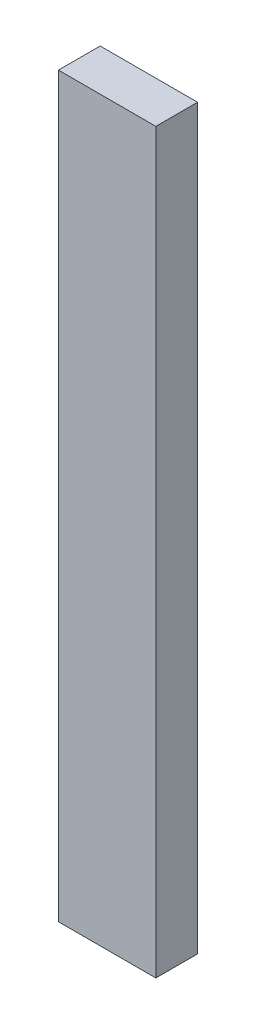
ISO-10303-21;
HEADER;
FILE_DESCRIPTION(('STEP AP214'),'2;1');
FILE_NAME('part.step','',(''),(''),'','','');
FILE_SCHEMA(('AUTOMOTIVE_DESIGN { 1 0 10303 214 1 1 1 1 }'));
ENDSEC;
DATA;
#1=APPLICATION_CONTEXT('core data for automotive mechanical design processes');
#2=APPLICATION_PROTOCOL_DEFINITION('international standard','automotive_design',2000,#1);
#3=PRODUCT_CONTEXT('',#1,'mechanical');
#4=PRODUCT('Part','Part','',(#3));
#5=PRODUCT_RELATED_PRODUCT_CATEGORY('part','',(#4));
#6=PRODUCT_DEFINITION_FORMATION('','',#4);
#7=PRODUCT_DEFINITION_CONTEXT('part definition',#1,'design');
#8=PRODUCT_DEFINITION('design','',#6,#7);
#9=PRODUCT_DEFINITION_SHAPE('','',#8);
#10=(LENGTH_UNIT() NAMED_UNIT(*) SI_UNIT(.MILLI.,.METRE.));
#11=(NAMED_UNIT(*) PLANE_ANGLE_UNIT() SI_UNIT($,.RADIAN.));
#12=(NAMED_UNIT(*) SI_UNIT($,.STERADIAN.) SOLID_ANGLE_UNIT());
#13=UNCERTAINTY_MEASURE_WITH_UNIT(LENGTH_MEASURE(1.E-05),#10,'distance_accuracy_value','');
#14=(GEOMETRIC_REPRESENTATION_CONTEXT(3) GLOBAL_UNCERTAINTY_ASSIGNED_CONTEXT((#13)) GLOBAL_UNIT_ASSIGNED_CONTEXT((#10,
#11,#12)) REPRESENTATION_CONTEXT('',''));
#15=CARTESIAN_POINT('',(0.,0.,0.));
#16=DIRECTION('',(0.,0.,1.));
#17=DIRECTION('',(1.,0.,0.));
#18=AXIS2_PLACEMENT_3D('',#15,#16,#17);
#19=CARTESIAN_POINT('',(-292.1,1149.34999999999,38.1));
#20=DIRECTION('',(1.,0.,0.));
#21=DIRECTION('',(0.,0.,-1.));
#22=AXIS2_PLACEMENT_3D('',#19,#20,#21);
#23=PLANE('',#22);
#24=DIRECTION('',(0.,-1.,0.));
#25=VECTOR('',#24,1.);
#26=CARTESIAN_POINT('',(-292.1,1149.34999999999,0.));
#27=LINE('',#26,#25);
#28=CARTESIAN_POINT('',(-292.1,1149.34999999999,0.));
#29=VERTEX_POINT('',#28);
#30=CARTESIAN_POINT('',(-292.1,476.250000000002,0.));
#31=VERTEX_POINT('',#30);
#32=EDGE_CURVE('E96',#29,#31,#27,.T.);
#33=ORIENTED_EDGE('',*,*,#32,.T.);
#34=DIRECTION('',(0.,0.,-1.));
#35=VECTOR('',#34,1.);
#36=CARTESIAN_POINT('',(-292.1,476.250000000002,38.1));
#37=LINE('',#36,#35);
#38=CARTESIAN_POINT('',(-292.1,476.250000000002,38.1));
#39=VERTEX_POINT('',#38);
#40=EDGE_CURVE('E11',#39,#31,#37,.T.);
#41=ORIENTED_EDGE('',*,*,#40,.F.);
#42=DIRECTION('',(0.,-1.,0.));
#43=VECTOR('',#42,1.);
#44=CARTESIAN_POINT('',(-292.1,1149.34999999999,38.1));
#45=LINE('',#44,#43);
#46=CARTESIAN_POINT('',(-292.1,1149.34999999999,38.1));
#47=VERTEX_POINT('',#46);
#48=EDGE_CURVE('E84',#47,#39,#45,.T.);
#49=ORIENTED_EDGE('',*,*,#48,.F.);
#50=DIRECTION('',(0.,0.,-1.));
#51=VECTOR('',#50,1.);
#52=CARTESIAN_POINT('',(-292.1,1149.34999999999,38.1));
#53=LINE('',#52,#51);
#54=EDGE_CURVE('E92',#47,#29,#53,.T.);
#55=ORIENTED_EDGE('',*,*,#54,.T.);
#56=EDGE_LOOP('',(#33,#41,#49,#55));
#57=FACE_BOUND('',#56,.T.);
#58=ADVANCED_FACE('F33',(#57),#23,.F.);
#59=CARTESIAN_POINT('',(-292.1,476.250000000002,38.1));
#60=DIRECTION('',(0.,1.,0.));
#61=DIRECTION('',(0.,0.,1.));
#62=AXIS2_PLACEMENT_3D('',#59,#60,#61);
#63=PLANE('',#62);
#64=DIRECTION('',(1.,0.,0.));
#65=VECTOR('',#64,1.);
#66=CARTESIAN_POINT('',(-292.1,476.250000000002,0.));
#67=LINE('',#66,#65);
#68=CARTESIAN_POINT('',(-203.2,476.250000000002,0.));
#69=VERTEX_POINT('',#68);
#70=EDGE_CURVE('E88',#31,#69,#67,.T.);
#71=ORIENTED_EDGE('',*,*,#70,.T.);
#72=DIRECTION('',(0.,0.,-1.));
#73=VECTOR('',#72,1.);
#74=CARTESIAN_POINT('',(-203.2,476.250000000002,38.1));
#75=LINE('',#74,#73);
#76=CARTESIAN_POINT('',(-203.2,476.250000000002,38.1));
#77=VERTEX_POINT('',#76);
#78=EDGE_CURVE('E41',#77,#69,#75,.T.);
#79=ORIENTED_EDGE('',*,*,#78,.F.);
#80=DIRECTION('',(1.,0.,0.));
#81=VECTOR('',#80,1.);
#82=CARTESIAN_POINT('',(-292.1,476.250000000002,38.1));
#83=LINE('',#82,#81);
#84=EDGE_CURVE('E79',#39,#77,#83,.T.);
#85=ORIENTED_EDGE('',*,*,#84,.F.);
#86=ORIENTED_EDGE('',*,*,#40,.T.);
#87=EDGE_LOOP('',(#71,#79,#85,#86));
#88=FACE_BOUND('',#87,.T.);
#89=ADVANCED_FACE('F87',(#88),#63,.F.);
#90=CARTESIAN_POINT('',(-203.2,1149.34999999999,38.1));
#91=DIRECTION('',(-1.,0.,0.));
#92=DIRECTION('',(0.,-1.,0.));
#93=AXIS2_PLACEMENT_3D('',#90,#91,#92);
#94=PLANE('',#93);
#95=DIRECTION('',(0.,1.,0.));
#96=VECTOR('',#95,1.);
#97=CARTESIAN_POINT('',(-203.2,1149.34999999999,0.));
#98=LINE('',#97,#96);
#99=CARTESIAN_POINT('',(-203.2,1149.34999999999,0.));
#100=VERTEX_POINT('',#99);
#101=EDGE_CURVE('E66',#69,#100,#98,.T.);
#102=ORIENTED_EDGE('',*,*,#101,.T.);
#103=DIRECTION('',(0.,0.,-1.));
#104=VECTOR('',#103,1.);
#105=CARTESIAN_POINT('',(-203.2,1149.34999999999,38.1));
#106=LINE('',#105,#104);
#107=CARTESIAN_POINT('',(-203.2,1149.34999999999,38.1));
#108=VERTEX_POINT('',#107);
#109=EDGE_CURVE('E89',#108,#100,#106,.T.);
#110=ORIENTED_EDGE('',*,*,#109,.F.);
#111=DIRECTION('',(0.,1.,0.));
#112=VECTOR('',#111,1.);
#113=CARTESIAN_POINT('',(-203.2,1149.34999999999,38.1));
#114=LINE('',#113,#112);
#115=EDGE_CURVE('E82',#77,#108,#114,.T.);
#116=ORIENTED_EDGE('',*,*,#115,.F.);
#117=ORIENTED_EDGE('',*,*,#78,.T.);
#118=EDGE_LOOP('',(#102,#110,#116,#117));
#119=FACE_BOUND('',#118,.T.);
#120=ADVANCED_FACE('F90',(#119),#94,.F.);
#121=CARTESIAN_POINT('',(-292.1,1149.34999999999,38.1));
#122=DIRECTION('',(0.,-1.,0.));
#123=DIRECTION('',(0.,0.,-1.));
#124=AXIS2_PLACEMENT_3D('',#121,#122,#123);
#125=PLANE('',#124);
#126=DIRECTION('',(-1.,0.,0.));
#127=VECTOR('',#126,1.);
#128=CARTESIAN_POINT('',(-292.1,1149.34999999999,0.));
#129=LINE('',#128,#127);
#130=EDGE_CURVE('E72',#100,#29,#129,.T.);
#131=ORIENTED_EDGE('',*,*,#130,.T.);
#132=ORIENTED_EDGE('',*,*,#54,.F.);
#133=DIRECTION('',(-1.,0.,0.));
#134=VECTOR('',#133,1.);
#135=CARTESIAN_POINT('',(-292.1,1149.34999999999,38.1));
#136=LINE('',#135,#134);
#137=EDGE_CURVE('E49',#108,#47,#136,.T.);
#138=ORIENTED_EDGE('',*,*,#137,.F.);
#139=ORIENTED_EDGE('',*,*,#109,.T.);
#140=EDGE_LOOP('',(#131,#132,#138,#139));
#141=FACE_BOUND('',#140,.T.);
#142=ADVANCED_FACE('F103',(#141),#125,.F.);
#143=CARTESIAN_POINT('',(0.,0.,38.1));
#144=DIRECTION('',(0.,0.,1.));
#145=DIRECTION('',(1.,0.,0.));
#146=AXIS2_PLACEMENT_3D('',#143,#144,#145);
#147=PLANE('',#146);
#148=ORIENTED_EDGE('',*,*,#48,.T.);
#149=ORIENTED_EDGE('',*,*,#84,.T.);
#150=ORIENTED_EDGE('',*,*,#115,.T.);
#151=ORIENTED_EDGE('',*,*,#137,.T.);
#152=EDGE_LOOP('',(#148,#149,#150,#151));
#153=FACE_BOUND('',#152,.T.);
#154=ADVANCED_FACE('F80',(#153),#147,.T.);
#155=CARTESIAN_POINT('',(0.,0.,0.));
#156=DIRECTION('',(0.,0.,1.));
#157=DIRECTION('',(1.,0.,0.));
#158=AXIS2_PLACEMENT_3D('',#155,#156,#157);
#159=PLANE('',#158);
#160=ORIENTED_EDGE('',*,*,#32,.F.);
#161=ORIENTED_EDGE('',*,*,#130,.F.);
#162=ORIENTED_EDGE('',*,*,#101,.F.);
#163=ORIENTED_EDGE('',*,*,#70,.F.);
#164=EDGE_LOOP('',(#160,#161,#162,#163));
#165=FACE_BOUND('',#164,.T.);
#166=ADVANCED_FACE('F106',(#165),#159,.F.);
#167=CLOSED_SHELL('',(#58,#89,#120,#142,#154,#166));
#168=MANIFOLD_SOLID_BREP('B2',#167);
#169=ADVANCED_BREP_SHAPE_REPRESENTATION('',(#18,#168),#14);
#170=SHAPE_DEFINITION_REPRESENTATION(#9,#169);
ENDSEC;
END-ISO-10303-21;
